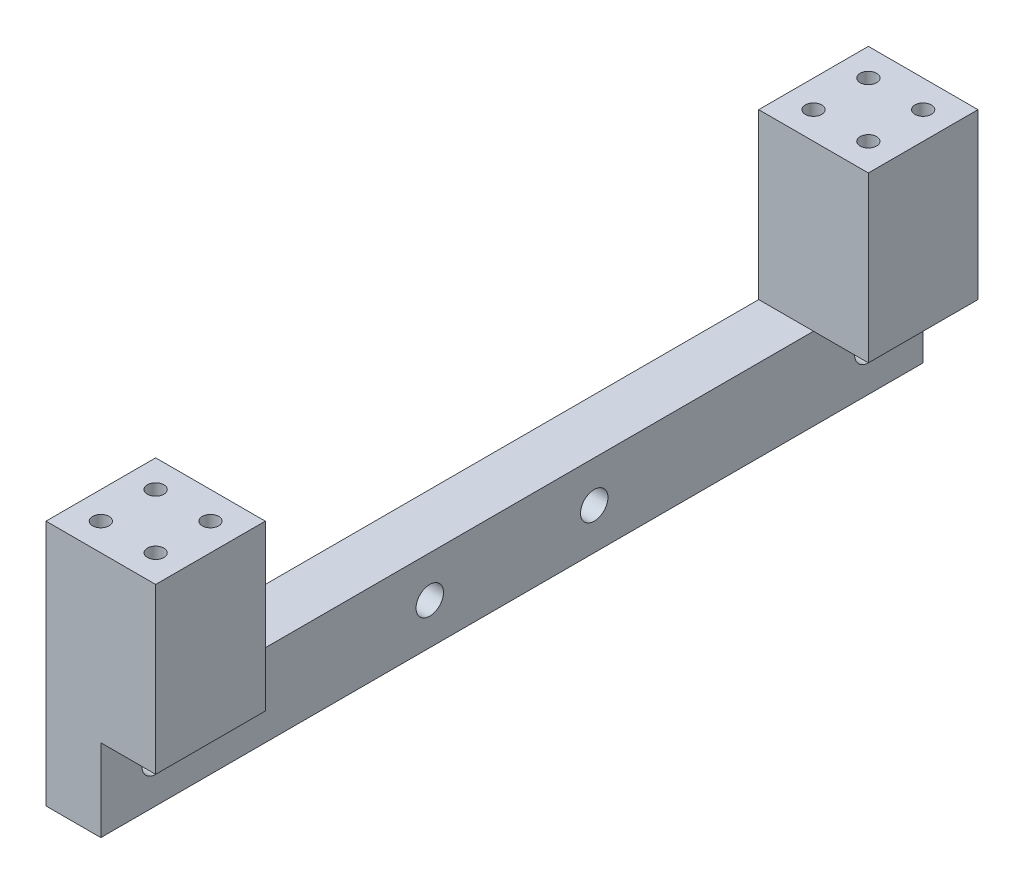
ISO-10303-21;
HEADER;
FILE_DESCRIPTION(('STEP AP214'),'2;1');
FILE_NAME('part.step','',(''),(''),'','','');
FILE_SCHEMA(('AUTOMOTIVE_DESIGN { 1 0 10303 214 1 1 1 1 }'));
ENDSEC;
DATA;
#1=APPLICATION_CONTEXT('core data for automotive mechanical design processes');
#2=APPLICATION_PROTOCOL_DEFINITION('international standard','automotive_design',2000,#1);
#3=PRODUCT_CONTEXT('',#1,'mechanical');
#4=PRODUCT('Part','Part','',(#3));
#5=PRODUCT_RELATED_PRODUCT_CATEGORY('part','',(#4));
#6=PRODUCT_DEFINITION_FORMATION('','',#4);
#7=PRODUCT_DEFINITION_CONTEXT('part definition',#1,'design');
#8=PRODUCT_DEFINITION('design','',#6,#7);
#9=PRODUCT_DEFINITION_SHAPE('','',#8);
#10=(LENGTH_UNIT() NAMED_UNIT(*) SI_UNIT(.MILLI.,.METRE.));
#11=(NAMED_UNIT(*) PLANE_ANGLE_UNIT() SI_UNIT($,.RADIAN.));
#12=(NAMED_UNIT(*) SI_UNIT($,.STERADIAN.) SOLID_ANGLE_UNIT());
#13=UNCERTAINTY_MEASURE_WITH_UNIT(LENGTH_MEASURE(1.E-05),#10,'distance_accuracy_value','');
#14=(GEOMETRIC_REPRESENTATION_CONTEXT(3) GLOBAL_UNCERTAINTY_ASSIGNED_CONTEXT((#13)) GLOBAL_UNIT_ASSIGNED_CONTEXT((#10,
#11,#12)) REPRESENTATION_CONTEXT('',''));
#15=CARTESIAN_POINT('',(0.,0.,0.));
#16=DIRECTION('',(0.,0.,1.));
#17=DIRECTION('',(1.,0.,0.));
#18=AXIS2_PLACEMENT_3D('',#15,#16,#17);
#19=CARTESIAN_POINT('',(0.,15.,0.));
#20=DIRECTION('',(0.,-1.,0.));
#21=DIRECTION('',(0.,0.,-1.));
#22=AXIS2_PLACEMENT_3D('',#19,#20,#21);
#23=PLANE('',#22);
#24=DIRECTION('',(-1.,0.,0.));
#25=VECTOR('',#24,1.);
#26=CARTESIAN_POINT('',(15.,15.,55.));
#27=LINE('',#26,#25);
#28=CARTESIAN_POINT('',(5.,15.,55.));
#29=VERTEX_POINT('',#28);
#30=CARTESIAN_POINT('',(-5.,15.,55.));
#31=VERTEX_POINT('',#30);
#32=EDGE_CURVE('E55',#29,#31,#27,.T.);
#33=ORIENTED_EDGE('',*,*,#32,.F.);
#34=DIRECTION('',(0.,0.,-1.));
#35=VECTOR('',#34,1.);
#36=CARTESIAN_POINT('',(5.,15.,75.));
#37=LINE('',#36,#35);
#38=CARTESIAN_POINT('',(5.,15.,-55.));
#39=VERTEX_POINT('',#38);
#40=EDGE_CURVE('E221',#29,#39,#37,.T.);
#41=ORIENTED_EDGE('',*,*,#40,.T.);
#42=DIRECTION('',(1.,0.,0.));
#43=VECTOR('',#42,1.);
#44=CARTESIAN_POINT('',(15.,15.,-55.));
#45=LINE('',#44,#43);
#46=CARTESIAN_POINT('',(-5.,15.,-55.));
#47=VERTEX_POINT('',#46);
#48=EDGE_CURVE('E195',#47,#39,#45,.T.);
#49=ORIENTED_EDGE('',*,*,#48,.F.);
#50=DIRECTION('',(0.,0.,1.));
#51=VECTOR('',#50,1.);
#52=CARTESIAN_POINT('',(-5.,15.,75.));
#53=LINE('',#52,#51);
#54=EDGE_CURVE('E60',#47,#31,#53,.T.);
#55=ORIENTED_EDGE('',*,*,#54,.T.);
#56=EDGE_LOOP('',(#33,#41,#49,#55));
#57=FACE_BOUND('',#56,.T.);
#58=ADVANCED_FACE('F39',(#57),#23,.F.);
#59=CARTESIAN_POINT('',(5.,15.,75.));
#60=DIRECTION('',(-1.,0.,0.));
#61=DIRECTION('',(0.,0.,1.));
#62=AXIS2_PLACEMENT_3D('',#59,#60,#61);
#63=PLANE('',#62);
#64=CARTESIAN_POINT('',(5.,7.5,-65.));
#65=DIRECTION('',(-1.,0.,0.));
#66=DIRECTION('',(0.,0.,1.));
#67=AXIS2_PLACEMENT_3D('',#64,#65,#66);
#68=CIRCLE('',#67,2.50000000000001);
#69=CARTESIAN_POINT('',(5.,7.5,-62.5));
#70=VERTEX_POINT('',#69);
#71=EDGE_CURVE('E156',#70,#70,#68,.T.);
#72=ORIENTED_EDGE('',*,*,#71,.T.);
#73=EDGE_LOOP('',(#72));
#74=FACE_BOUND('',#73,.T.);
#75=CARTESIAN_POINT('',(5.,7.5,-15.));
#76=DIRECTION('',(-1.,0.,0.));
#77=DIRECTION('',(0.,0.,1.));
#78=AXIS2_PLACEMENT_3D('',#75,#76,#77);
#79=CIRCLE('',#78,2.5);
#80=CARTESIAN_POINT('',(5.,7.5,-12.5));
#81=VERTEX_POINT('',#80);
#82=EDGE_CURVE('E660',#81,#81,#79,.T.);
#83=ORIENTED_EDGE('',*,*,#82,.T.);
#84=EDGE_LOOP('',(#83));
#85=FACE_BOUND('',#84,.T.);
#86=CARTESIAN_POINT('',(5.,7.5,15.));
#87=DIRECTION('',(-1.,0.,0.));
#88=DIRECTION('',(0.,0.,1.));
#89=AXIS2_PLACEMENT_3D('',#86,#87,#88);
#90=CIRCLE('',#89,2.5);
#91=CARTESIAN_POINT('',(5.,7.5,17.5));
#92=VERTEX_POINT('',#91);
#93=EDGE_CURVE('E657',#92,#92,#90,.T.);
#94=ORIENTED_EDGE('',*,*,#93,.T.);
#95=EDGE_LOOP('',(#94));
#96=FACE_BOUND('',#95,.T.);
#97=CARTESIAN_POINT('',(5.,7.5,65.));
#98=DIRECTION('',(-1.,0.,0.));
#99=DIRECTION('',(0.,0.,1.));
#100=AXIS2_PLACEMENT_3D('',#97,#98,#99);
#101=CIRCLE('',#100,2.50000000000001);
#102=CARTESIAN_POINT('',(5.,7.5,67.5));
#103=VERTEX_POINT('',#102);
#104=EDGE_CURVE('E642',#103,#103,#101,.T.);
#105=ORIENTED_EDGE('',*,*,#104,.T.);
#106=EDGE_LOOP('',(#105));
#107=FACE_BOUND('',#106,.T.);
#108=DIRECTION('',(0.,0.,-1.));
#109=VECTOR('',#108,1.);
#110=CARTESIAN_POINT('',(5.,0.,75.));
#111=LINE('',#110,#109);
#112=CARTESIAN_POINT('',(5.,0.,75.));
#113=VERTEX_POINT('',#112);
#114=CARTESIAN_POINT('',(5.,0.,-75.));
#115=VERTEX_POINT('',#114);
#116=EDGE_CURVE('E216',#113,#115,#111,.T.);
#117=ORIENTED_EDGE('',*,*,#116,.T.);
#118=DIRECTION('',(0.,-1.,0.));
#119=VECTOR('',#118,1.);
#120=CARTESIAN_POINT('',(5.,15.,-75.));
#121=LINE('',#120,#119);
#122=CARTESIAN_POINT('',(5.,15.,-75.));
#123=VERTEX_POINT('',#122);
#124=EDGE_CURVE('E11',#123,#115,#121,.T.);
#125=ORIENTED_EDGE('',*,*,#124,.F.);
#126=EDGE_CURVE('E222',#39,#123,#37,.T.);
#127=ORIENTED_EDGE('',*,*,#126,.F.);
#128=ORIENTED_EDGE('',*,*,#40,.F.);
#129=CARTESIAN_POINT('',(5.,15.,75.));
#130=VERTEX_POINT('',#129);
#131=EDGE_CURVE('E217',#130,#29,#37,.T.);
#132=ORIENTED_EDGE('',*,*,#131,.F.);
#133=DIRECTION('',(0.,-1.,0.));
#134=VECTOR('',#133,1.);
#135=CARTESIAN_POINT('',(5.,15.,75.));
#136=LINE('',#135,#134);
#137=EDGE_CURVE('E133',#130,#113,#136,.T.);
#138=ORIENTED_EDGE('',*,*,#137,.T.);
#139=EDGE_LOOP('',(#117,#125,#127,#128,#132,#138));
#140=FACE_BOUND('',#139,.T.);
#141=ADVANCED_FACE('F41',(#74,#85,#96,#107,#140),#63,.F.);
#142=CARTESIAN_POINT('',(-5.,15.,-75.));
#143=DIRECTION('',(0.,0.,1.));
#144=DIRECTION('',(1.,0.,0.));
#145=AXIS2_PLACEMENT_3D('',#142,#143,#144);
#146=PLANE('',#145);
#147=DIRECTION('',(-1.,0.,0.));
#148=VECTOR('',#147,1.);
#149=CARTESIAN_POINT('',(-5.,0.,-75.));
#150=LINE('',#149,#148);
#151=CARTESIAN_POINT('',(-5.,0.,-75.));
#152=VERTEX_POINT('',#151);
#153=EDGE_CURVE('E228',#115,#152,#150,.T.);
#154=ORIENTED_EDGE('',*,*,#153,.T.);
#155=DIRECTION('',(0.,-1.,0.));
#156=VECTOR('',#155,1.);
#157=CARTESIAN_POINT('',(-5.,15.,-75.));
#158=LINE('',#157,#156);
#159=CARTESIAN_POINT('',(-5.,45.,-75.));
#160=VERTEX_POINT('',#159);
#161=EDGE_CURVE('E48',#160,#152,#158,.T.);
#162=ORIENTED_EDGE('',*,*,#161,.F.);
#163=DIRECTION('',(-1.,0.,0.));
#164=VECTOR('',#163,1.);
#165=CARTESIAN_POINT('',(15.,45.,-75.));
#166=LINE('',#165,#164);
#167=CARTESIAN_POINT('',(15.,45.,-75.));
#168=VERTEX_POINT('',#167);
#169=EDGE_CURVE('E190',#168,#160,#166,.T.);
#170=ORIENTED_EDGE('',*,*,#169,.F.);
#171=DIRECTION('',(0.,-1.,0.));
#172=VECTOR('',#171,1.);
#173=CARTESIAN_POINT('',(15.,45.,-75.));
#174=LINE('',#173,#172);
#175=CARTESIAN_POINT('',(15.,15.,-75.));
#176=VERTEX_POINT('',#175);
#177=EDGE_CURVE('E194',#168,#176,#174,.T.);
#178=ORIENTED_EDGE('',*,*,#177,.T.);
#179=DIRECTION('',(-1.,0.,0.));
#180=VECTOR('',#179,1.);
#181=CARTESIAN_POINT('',(15.,15.,-75.));
#182=LINE('',#181,#180);
#183=EDGE_CURVE('E184',#176,#123,#182,.T.);
#184=ORIENTED_EDGE('',*,*,#183,.T.);
#185=ORIENTED_EDGE('',*,*,#124,.T.);
#186=EDGE_LOOP('',(#154,#162,#170,#178,#184,#185));
#187=FACE_BOUND('',#186,.T.);
#188=ADVANCED_FACE('F274',(#187),#146,.F.);
#189=CARTESIAN_POINT('',(-5.,15.,75.));
#190=DIRECTION('',(1.,0.,0.));
#191=DIRECTION('',(0.,0.,-1.));
#192=AXIS2_PLACEMENT_3D('',#189,#190,#191);
#193=PLANE('',#192);
#194=CARTESIAN_POINT('',(-5.,7.5,-65.));
#195=DIRECTION('',(-1.,0.,0.));
#196=DIRECTION('',(0.,0.,1.));
#197=AXIS2_PLACEMENT_3D('',#194,#195,#196);
#198=CIRCLE('',#197,2.50000000000001);
#199=CARTESIAN_POINT('',(-5.,7.5,-62.5));
#200=VERTEX_POINT('',#199);
#201=EDGE_CURVE('E638',#200,#200,#198,.T.);
#202=ORIENTED_EDGE('',*,*,#201,.F.);
#203=EDGE_LOOP('',(#202));
#204=FACE_BOUND('',#203,.T.);
#205=CARTESIAN_POINT('',(-5.,7.5,-15.));
#206=DIRECTION('',(-1.,0.,0.));
#207=DIRECTION('',(0.,0.,1.));
#208=AXIS2_PLACEMENT_3D('',#205,#206,#207);
#209=CIRCLE('',#208,2.5);
#210=CARTESIAN_POINT('',(-5.,7.5,-12.5));
#211=VERTEX_POINT('',#210);
#212=EDGE_CURVE('E643',#211,#211,#209,.T.);
#213=ORIENTED_EDGE('',*,*,#212,.F.);
#214=EDGE_LOOP('',(#213));
#215=FACE_BOUND('',#214,.T.);
#216=CARTESIAN_POINT('',(-5.,7.5,15.));
#217=DIRECTION('',(-1.,0.,0.));
#218=DIRECTION('',(0.,0.,1.));
#219=AXIS2_PLACEMENT_3D('',#216,#217,#218);
#220=CIRCLE('',#219,2.5);
#221=CARTESIAN_POINT('',(-5.,7.5,17.5));
#222=VERTEX_POINT('',#221);
#223=EDGE_CURVE('E647',#222,#222,#220,.T.);
#224=ORIENTED_EDGE('',*,*,#223,.F.);
#225=EDGE_LOOP('',(#224));
#226=FACE_BOUND('',#225,.T.);
#227=CARTESIAN_POINT('',(-5.,7.5,65.));
#228=DIRECTION('',(-1.,0.,0.));
#229=DIRECTION('',(0.,0.,1.));
#230=AXIS2_PLACEMENT_3D('',#227,#228,#229);
#231=CIRCLE('',#230,2.50000000000001);
#232=CARTESIAN_POINT('',(-5.,7.5,67.5));
#233=VERTEX_POINT('',#232);
#234=EDGE_CURVE('E634',#233,#233,#231,.T.);
#235=ORIENTED_EDGE('',*,*,#234,.F.);
#236=EDGE_LOOP('',(#235));
#237=FACE_BOUND('',#236,.T.);
#238=DIRECTION('',(0.,0.,1.));
#239=VECTOR('',#238,1.);
#240=CARTESIAN_POINT('',(-5.,0.,75.));
#241=LINE('',#240,#239);
#242=CARTESIAN_POINT('',(-5.,0.,75.));
#243=VERTEX_POINT('',#242);
#244=EDGE_CURVE('E129',#152,#243,#241,.T.);
#245=ORIENTED_EDGE('',*,*,#244,.T.);
#246=DIRECTION('',(0.,-1.,0.));
#247=VECTOR('',#246,1.);
#248=CARTESIAN_POINT('',(-5.,15.,75.));
#249=LINE('',#248,#247);
#250=CARTESIAN_POINT('',(-5.,45.,75.));
#251=VERTEX_POINT('',#250);
#252=EDGE_CURVE('E121',#251,#243,#249,.T.);
#253=ORIENTED_EDGE('',*,*,#252,.F.);
#254=DIRECTION('',(0.,0.,1.));
#255=VECTOR('',#254,1.);
#256=CARTESIAN_POINT('',(-5.,45.,55.));
#257=LINE('',#256,#255);
#258=CARTESIAN_POINT('',(-5.,45.,55.));
#259=VERTEX_POINT('',#258);
#260=EDGE_CURVE('E126',#259,#251,#257,.T.);
#261=ORIENTED_EDGE('',*,*,#260,.F.);
#262=DIRECTION('',(0.,-1.,0.));
#263=VECTOR('',#262,1.);
#264=CARTESIAN_POINT('',(-5.,45.,55.));
#265=LINE('',#264,#263);
#266=EDGE_CURVE('E163',#259,#31,#265,.T.);
#267=ORIENTED_EDGE('',*,*,#266,.T.);
#268=ORIENTED_EDGE('',*,*,#54,.F.);
#269=DIRECTION('',(0.,-1.,0.));
#270=VECTOR('',#269,1.);
#271=CARTESIAN_POINT('',(-5.,45.,-55.));
#272=LINE('',#271,#270);
#273=CARTESIAN_POINT('',(-5.,45.,-55.));
#274=VERTEX_POINT('',#273);
#275=EDGE_CURVE('E212',#274,#47,#272,.T.);
#276=ORIENTED_EDGE('',*,*,#275,.F.);
#277=DIRECTION('',(0.,0.,1.));
#278=VECTOR('',#277,1.);
#279=CARTESIAN_POINT('',(-5.,45.,-55.));
#280=LINE('',#279,#278);
#281=EDGE_CURVE('E179',#160,#274,#280,.T.);
#282=ORIENTED_EDGE('',*,*,#281,.F.);
#283=ORIENTED_EDGE('',*,*,#161,.T.);
#284=EDGE_LOOP('',(#245,#253,#261,#267,#268,#276,#282,#283));
#285=FACE_BOUND('',#284,.T.);
#286=ADVANCED_FACE('F123',(#204,#215,#226,#237,#285),#193,.F.);
#287=CARTESIAN_POINT('',(-5.,15.,75.));
#288=DIRECTION('',(0.,0.,-1.));
#289=DIRECTION('',(-1.,0.,0.));
#290=AXIS2_PLACEMENT_3D('',#287,#288,#289);
#291=PLANE('',#290);
#292=DIRECTION('',(1.,0.,0.));
#293=VECTOR('',#292,1.);
#294=CARTESIAN_POINT('',(-5.,0.,75.));
#295=LINE('',#294,#293);
#296=EDGE_CURVE('E233',#243,#113,#295,.T.);
#297=ORIENTED_EDGE('',*,*,#296,.T.);
#298=ORIENTED_EDGE('',*,*,#137,.F.);
#299=DIRECTION('',(1.,0.,0.));
#300=VECTOR('',#299,1.);
#301=CARTESIAN_POINT('',(15.,15.,75.));
#302=LINE('',#301,#300);
#303=CARTESIAN_POINT('',(15.,15.,75.));
#304=VERTEX_POINT('',#303);
#305=EDGE_CURVE('E164',#130,#304,#302,.T.);
#306=ORIENTED_EDGE('',*,*,#305,.T.);
#307=DIRECTION('',(0.,-1.,0.));
#308=VECTOR('',#307,1.);
#309=CARTESIAN_POINT('',(15.,45.,75.));
#310=LINE('',#309,#308);
#311=CARTESIAN_POINT('',(15.,45.,75.));
#312=VERTEX_POINT('',#311);
#313=EDGE_CURVE('E139',#312,#304,#310,.T.);
#314=ORIENTED_EDGE('',*,*,#313,.F.);
#315=DIRECTION('',(1.,0.,0.));
#316=VECTOR('',#315,1.);
#317=CARTESIAN_POINT('',(15.,45.,75.));
#318=LINE('',#317,#316);
#319=EDGE_CURVE('E136',#251,#312,#318,.T.);
#320=ORIENTED_EDGE('',*,*,#319,.F.);
#321=ORIENTED_EDGE('',*,*,#252,.T.);
#322=EDGE_LOOP('',(#297,#298,#306,#314,#320,#321));
#323=FACE_BOUND('',#322,.T.);
#324=ADVANCED_FACE('F137',(#323),#291,.F.);
#325=CARTESIAN_POINT('',(0.,0.,0.));
#326=DIRECTION('',(0.,-1.,0.));
#327=DIRECTION('',(0.,0.,-1.));
#328=AXIS2_PLACEMENT_3D('',#325,#326,#327);
#329=PLANE('',#328);
#330=ORIENTED_EDGE('',*,*,#116,.F.);
#331=ORIENTED_EDGE('',*,*,#296,.F.);
#332=ORIENTED_EDGE('',*,*,#244,.F.);
#333=ORIENTED_EDGE('',*,*,#153,.F.);
#334=EDGE_LOOP('',(#330,#331,#332,#333));
#335=FACE_BOUND('',#334,.T.);
#336=ADVANCED_FACE('F245',(#335),#329,.T.);
#337=CARTESIAN_POINT('',(0.,15.,0.));
#338=DIRECTION('',(0.,1.,0.));
#339=DIRECTION('',(0.,0.,1.));
#340=AXIS2_PLACEMENT_3D('',#337,#338,#339);
#341=PLANE('',#340);
#342=CARTESIAN_POINT('',(15.,15.,-55.));
#343=VERTEX_POINT('',#342);
#344=EDGE_CURVE('E178',#39,#343,#45,.T.);
#345=ORIENTED_EDGE('',*,*,#344,.F.);
#346=ORIENTED_EDGE('',*,*,#126,.T.);
#347=ORIENTED_EDGE('',*,*,#183,.F.);
#348=DIRECTION('',(0.,0.,-1.));
#349=VECTOR('',#348,1.);
#350=CARTESIAN_POINT('',(15.,15.,-55.));
#351=LINE('',#350,#349);
#352=EDGE_CURVE('E199',#343,#176,#351,.T.);
#353=ORIENTED_EDGE('',*,*,#352,.F.);
#354=EDGE_LOOP('',(#345,#346,#347,#353));
#355=FACE_BOUND('',#354,.T.);
#356=ADVANCED_FACE('F282',(#355),#341,.F.);
#357=CARTESIAN_POINT('',(15.,45.,-55.));
#358=DIRECTION('',(0.,0.,-1.));
#359=DIRECTION('',(-1.,0.,0.));
#360=AXIS2_PLACEMENT_3D('',#357,#358,#359);
#361=PLANE('',#360);
#362=ORIENTED_EDGE('',*,*,#48,.T.);
#363=ORIENTED_EDGE('',*,*,#344,.T.);
#364=DIRECTION('',(0.,-1.,0.));
#365=VECTOR('',#364,1.);
#366=CARTESIAN_POINT('',(15.,45.,-55.));
#367=LINE('',#366,#365);
#368=CARTESIAN_POINT('',(15.,45.,-55.));
#369=VERTEX_POINT('',#368);
#370=EDGE_CURVE('E208',#369,#343,#367,.T.);
#371=ORIENTED_EDGE('',*,*,#370,.F.);
#372=DIRECTION('',(1.,0.,0.));
#373=VECTOR('',#372,1.);
#374=CARTESIAN_POINT('',(15.,45.,-55.));
#375=LINE('',#374,#373);
#376=EDGE_CURVE('E183',#274,#369,#375,.T.);
#377=ORIENTED_EDGE('',*,*,#376,.F.);
#378=ORIENTED_EDGE('',*,*,#275,.T.);
#379=EDGE_LOOP('',(#362,#363,#371,#377,#378));
#380=FACE_BOUND('',#379,.T.);
#381=ADVANCED_FACE('F278',(#380),#361,.F.);
#382=CARTESIAN_POINT('',(15.,45.,-55.));
#383=DIRECTION('',(-1.,0.,0.));
#384=DIRECTION('',(0.,0.,1.));
#385=AXIS2_PLACEMENT_3D('',#382,#383,#384);
#386=PLANE('',#385);
#387=ORIENTED_EDGE('',*,*,#352,.T.);
#388=ORIENTED_EDGE('',*,*,#177,.F.);
#389=DIRECTION('',(0.,0.,-1.));
#390=VECTOR('',#389,1.);
#391=CARTESIAN_POINT('',(15.,45.,-55.));
#392=LINE('',#391,#390);
#393=EDGE_CURVE('E187',#369,#168,#392,.T.);
#394=ORIENTED_EDGE('',*,*,#393,.F.);
#395=ORIENTED_EDGE('',*,*,#370,.T.);
#396=EDGE_LOOP('',(#387,#388,#394,#395));
#397=FACE_BOUND('',#396,.T.);
#398=ADVANCED_FACE('F303',(#397),#386,.F.);
#399=CARTESIAN_POINT('',(0.,45.,0.));
#400=DIRECTION('',(0.,1.,0.));
#401=DIRECTION('',(0.,0.,1.));
#402=AXIS2_PLACEMENT_3D('',#399,#400,#401);
#403=PLANE('',#402);
#404=CARTESIAN_POINT('',(10.,45.,-70.));
#405=DIRECTION('',(0.,1.,0.));
#406=DIRECTION('',(0.,0.,1.));
#407=AXIS2_PLACEMENT_3D('',#404,#405,#406);
#408=CIRCLE('',#407,1.5);
#409=CARTESIAN_POINT('',(10.,45.,-68.5));
#410=VERTEX_POINT('',#409);
#411=EDGE_CURVE('E619',#410,#410,#408,.T.);
#412=ORIENTED_EDGE('',*,*,#411,.F.);
#413=EDGE_LOOP('',(#412));
#414=FACE_BOUND('',#413,.T.);
#415=CARTESIAN_POINT('',(0.,45.,-60.));
#416=DIRECTION('',(0.,1.,0.));
#417=DIRECTION('',(0.,0.,1.));
#418=AXIS2_PLACEMENT_3D('',#415,#416,#417);
#419=CIRCLE('',#418,1.5);
#420=CARTESIAN_POINT('',(0.,45.,-58.5));
#421=VERTEX_POINT('',#420);
#422=EDGE_CURVE('E610',#421,#421,#419,.T.);
#423=ORIENTED_EDGE('',*,*,#422,.F.);
#424=EDGE_LOOP('',(#423));
#425=FACE_BOUND('',#424,.T.);
#426=CARTESIAN_POINT('',(10.,45.,-60.));
#427=DIRECTION('',(0.,1.,0.));
#428=DIRECTION('',(0.,0.,1.));
#429=AXIS2_PLACEMENT_3D('',#426,#427,#428);
#430=CIRCLE('',#429,1.5);
#431=CARTESIAN_POINT('',(10.,45.,-58.5));
#432=VERTEX_POINT('',#431);
#433=EDGE_CURVE('E604',#432,#432,#430,.T.);
#434=ORIENTED_EDGE('',*,*,#433,.F.);
#435=EDGE_LOOP('',(#434));
#436=FACE_BOUND('',#435,.T.);
#437=CARTESIAN_POINT('',(0.,45.,-70.));
#438=DIRECTION('',(0.,1.,0.));
#439=DIRECTION('',(0.,0.,1.));
#440=AXIS2_PLACEMENT_3D('',#437,#438,#439);
#441=CIRCLE('',#440,1.5);
#442=CARTESIAN_POINT('',(0.,45.,-68.5));
#443=VERTEX_POINT('',#442);
#444=EDGE_CURVE('E618',#443,#443,#441,.T.);
#445=ORIENTED_EDGE('',*,*,#444,.F.);
#446=EDGE_LOOP('',(#445));
#447=FACE_BOUND('',#446,.T.);
#448=ORIENTED_EDGE('',*,*,#281,.T.);
#449=ORIENTED_EDGE('',*,*,#376,.T.);
#450=ORIENTED_EDGE('',*,*,#393,.T.);
#451=ORIENTED_EDGE('',*,*,#169,.T.);
#452=EDGE_LOOP('',(#448,#449,#450,#451));
#453=FACE_BOUND('',#452,.T.);
#454=ADVANCED_FACE('F266',(#414,#425,#436,#447,#453),#403,.T.);
#455=CARTESIAN_POINT('',(0.,15.,0.));
#456=DIRECTION('',(0.,-1.,0.));
#457=DIRECTION('',(0.,0.,-1.));
#458=AXIS2_PLACEMENT_3D('',#455,#456,#457);
#459=PLANE('',#458);
#460=ORIENTED_EDGE('',*,*,#131,.T.);
#461=CARTESIAN_POINT('',(15.,15.,55.));
#462=VERTEX_POINT('',#461);
#463=EDGE_CURVE('E150',#462,#29,#27,.T.);
#464=ORIENTED_EDGE('',*,*,#463,.F.);
#465=DIRECTION('',(0.,0.,-1.));
#466=VECTOR('',#465,1.);
#467=CARTESIAN_POINT('',(15.,15.,55.));
#468=LINE('',#467,#466);
#469=EDGE_CURVE('E167',#304,#462,#468,.T.);
#470=ORIENTED_EDGE('',*,*,#469,.F.);
#471=ORIENTED_EDGE('',*,*,#305,.F.);
#472=EDGE_LOOP('',(#460,#464,#470,#471));
#473=FACE_BOUND('',#472,.T.);
#474=ADVANCED_FACE('F252',(#473),#459,.T.);
#475=CARTESIAN_POINT('',(15.,45.,55.));
#476=DIRECTION('',(-1.,0.,0.));
#477=DIRECTION('',(0.,0.,1.));
#478=AXIS2_PLACEMENT_3D('',#475,#476,#477);
#479=PLANE('',#478);
#480=ORIENTED_EDGE('',*,*,#469,.T.);
#481=DIRECTION('',(0.,-1.,0.));
#482=VECTOR('',#481,1.);
#483=CARTESIAN_POINT('',(15.,45.,55.));
#484=LINE('',#483,#482);
#485=CARTESIAN_POINT('',(15.,45.,55.));
#486=VERTEX_POINT('',#485);
#487=EDGE_CURVE('E172',#486,#462,#484,.T.);
#488=ORIENTED_EDGE('',*,*,#487,.F.);
#489=DIRECTION('',(0.,0.,-1.));
#490=VECTOR('',#489,1.);
#491=CARTESIAN_POINT('',(15.,45.,55.));
#492=LINE('',#491,#490);
#493=EDGE_CURVE('E143',#312,#486,#492,.T.);
#494=ORIENTED_EDGE('',*,*,#493,.F.);
#495=ORIENTED_EDGE('',*,*,#313,.T.);
#496=EDGE_LOOP('',(#480,#488,#494,#495));
#497=FACE_BOUND('',#496,.T.);
#498=ADVANCED_FACE('F258',(#497),#479,.F.);
#499=CARTESIAN_POINT('',(15.,45.,55.));
#500=DIRECTION('',(0.,0.,1.));
#501=DIRECTION('',(1.,0.,0.));
#502=AXIS2_PLACEMENT_3D('',#499,#500,#501);
#503=PLANE('',#502);
#504=ORIENTED_EDGE('',*,*,#463,.T.);
#505=ORIENTED_EDGE('',*,*,#32,.T.);
#506=ORIENTED_EDGE('',*,*,#266,.F.);
#507=DIRECTION('',(-1.,0.,0.));
#508=VECTOR('',#507,1.);
#509=CARTESIAN_POINT('',(15.,45.,55.));
#510=LINE('',#509,#508);
#511=EDGE_CURVE('E147',#486,#259,#510,.T.);
#512=ORIENTED_EDGE('',*,*,#511,.F.);
#513=ORIENTED_EDGE('',*,*,#487,.T.);
#514=EDGE_LOOP('',(#504,#505,#506,#512,#513));
#515=FACE_BOUND('',#514,.T.);
#516=ADVANCED_FACE('F255',(#515),#503,.F.);
#517=CARTESIAN_POINT('',(0.,45.,0.));
#518=DIRECTION('',(0.,-1.,0.));
#519=DIRECTION('',(0.,0.,-1.));
#520=AXIS2_PLACEMENT_3D('',#517,#518,#519);
#521=PLANE('',#520);
#522=CARTESIAN_POINT('',(10.,45.,70.));
#523=DIRECTION('',(0.,-1.,0.));
#524=DIRECTION('',(0.,0.,-1.));
#525=AXIS2_PLACEMENT_3D('',#522,#523,#524);
#526=CIRCLE('',#525,1.5);
#527=CARTESIAN_POINT('',(10.,45.,68.5));
#528=VERTEX_POINT('',#527);
#529=EDGE_CURVE('E580',#528,#528,#526,.T.);
#530=ORIENTED_EDGE('',*,*,#529,.T.);
#531=EDGE_LOOP('',(#530));
#532=FACE_BOUND('',#531,.T.);
#533=CARTESIAN_POINT('',(0.,45.,60.));
#534=DIRECTION('',(0.,-1.,0.));
#535=DIRECTION('',(0.,0.,-1.));
#536=AXIS2_PLACEMENT_3D('',#533,#534,#535);
#537=CIRCLE('',#536,1.5);
#538=CARTESIAN_POINT('',(0.,45.,58.5));
#539=VERTEX_POINT('',#538);
#540=EDGE_CURVE('E597',#539,#539,#537,.T.);
#541=ORIENTED_EDGE('',*,*,#540,.T.);
#542=EDGE_LOOP('',(#541));
#543=FACE_BOUND('',#542,.T.);
#544=CARTESIAN_POINT('',(10.,45.,60.));
#545=DIRECTION('',(0.,-1.,0.));
#546=DIRECTION('',(0.,0.,-1.));
#547=AXIS2_PLACEMENT_3D('',#544,#545,#546);
#548=CIRCLE('',#547,1.5);
#549=CARTESIAN_POINT('',(10.,45.,58.5));
#550=VERTEX_POINT('',#549);
#551=EDGE_CURVE('E591',#550,#550,#548,.T.);
#552=ORIENTED_EDGE('',*,*,#551,.T.);
#553=EDGE_LOOP('',(#552));
#554=FACE_BOUND('',#553,.T.);
#555=CARTESIAN_POINT('',(0.,45.,70.));
#556=DIRECTION('',(0.,-1.,0.));
#557=DIRECTION('',(0.,0.,-1.));
#558=AXIS2_PLACEMENT_3D('',#555,#556,#557);
#559=CIRCLE('',#558,1.5);
#560=CARTESIAN_POINT('',(0.,45.,68.5));
#561=VERTEX_POINT('',#560);
#562=EDGE_CURVE('E579',#561,#561,#559,.T.);
#563=ORIENTED_EDGE('',*,*,#562,.T.);
#564=EDGE_LOOP('',(#563));
#565=FACE_BOUND('',#564,.T.);
#566=ORIENTED_EDGE('',*,*,#260,.T.);
#567=ORIENTED_EDGE('',*,*,#319,.T.);
#568=ORIENTED_EDGE('',*,*,#493,.T.);
#569=ORIENTED_EDGE('',*,*,#511,.T.);
#570=EDGE_LOOP('',(#566,#567,#568,#569));
#571=FACE_BOUND('',#570,.T.);
#572=ADVANCED_FACE('F145',(#532,#543,#554,#565,#571),#521,.F.);
#573=CARTESIAN_POINT('',(15.,7.5,65.));
#574=DIRECTION('',(-1.,0.,0.));
#575=DIRECTION('',(0.,0.,1.));
#576=AXIS2_PLACEMENT_3D('',#573,#574,#575);
#577=CYLINDRICAL_SURFACE('',#576,2.50000000000001);
#578=ORIENTED_EDGE('',*,*,#234,.T.);
#579=EDGE_LOOP('',(#578));
#580=FACE_BOUND('',#579,.T.);
#581=ORIENTED_EDGE('',*,*,#104,.F.);
#582=EDGE_LOOP('',(#581));
#583=FACE_BOUND('',#582,.T.);
#584=ADVANCED_FACE('F364',(#580,#583),#577,.F.);
#585=CARTESIAN_POINT('',(15.,7.5,15.));
#586=DIRECTION('',(-1.,0.,0.));
#587=DIRECTION('',(0.,0.,1.));
#588=AXIS2_PLACEMENT_3D('',#585,#586,#587);
#589=CYLINDRICAL_SURFACE('',#588,2.5);
#590=ORIENTED_EDGE('',*,*,#223,.T.);
#591=EDGE_LOOP('',(#590));
#592=FACE_BOUND('',#591,.T.);
#593=ORIENTED_EDGE('',*,*,#93,.F.);
#594=EDGE_LOOP('',(#593));
#595=FACE_BOUND('',#594,.T.);
#596=ADVANCED_FACE('F369',(#592,#595),#589,.F.);
#597=CARTESIAN_POINT('',(15.,7.5,-15.));
#598=DIRECTION('',(-1.,0.,0.));
#599=DIRECTION('',(0.,0.,1.));
#600=AXIS2_PLACEMENT_3D('',#597,#598,#599);
#601=CYLINDRICAL_SURFACE('',#600,2.5);
#602=ORIENTED_EDGE('',*,*,#212,.T.);
#603=EDGE_LOOP('',(#602));
#604=FACE_BOUND('',#603,.T.);
#605=ORIENTED_EDGE('',*,*,#82,.F.);
#606=EDGE_LOOP('',(#605));
#607=FACE_BOUND('',#606,.T.);
#608=ADVANCED_FACE('F379',(#604,#607),#601,.F.);
#609=CARTESIAN_POINT('',(15.,7.5,-65.));
#610=DIRECTION('',(-1.,0.,0.));
#611=DIRECTION('',(0.,0.,1.));
#612=AXIS2_PLACEMENT_3D('',#609,#610,#611);
#613=CYLINDRICAL_SURFACE('',#612,2.50000000000001);
#614=ORIENTED_EDGE('',*,*,#201,.T.);
#615=EDGE_LOOP('',(#614));
#616=FACE_BOUND('',#615,.T.);
#617=ORIENTED_EDGE('',*,*,#71,.F.);
#618=EDGE_LOOP('',(#617));
#619=FACE_BOUND('',#618,.T.);
#620=ADVANCED_FACE('F389',(#616,#619),#613,.F.);
#621=CARTESIAN_POINT('',(0.,35.,-70.));
#622=DIRECTION('',(0.,1.,0.));
#623=DIRECTION('',(0.,0.,1.));
#624=AXIS2_PLACEMENT_3D('',#621,#622,#623);
#625=CYLINDRICAL_SURFACE('',#624,1.5);
#626=CARTESIAN_POINT('',(0.,35.,-70.));
#627=DIRECTION('',(0.,1.,0.));
#628=DIRECTION('',(0.,0.,1.));
#629=AXIS2_PLACEMENT_3D('',#626,#627,#628);
#630=CIRCLE('',#629,1.5);
#631=CARTESIAN_POINT('',(0.,35.,-68.5));
#632=VERTEX_POINT('',#631);
#633=EDGE_CURVE('E630',#632,#632,#630,.T.);
#634=ORIENTED_EDGE('',*,*,#633,.F.);
#635=EDGE_LOOP('',(#634));
#636=FACE_BOUND('',#635,.T.);
#637=ORIENTED_EDGE('',*,*,#444,.T.);
#638=EDGE_LOOP('',(#637));
#639=FACE_BOUND('',#638,.T.);
#640=ADVANCED_FACE('F399',(#636,#639),#625,.F.);
#641=CARTESIAN_POINT('',(0.,35.,-70.));
#642=DIRECTION('',(0.,1.,0.));
#643=DIRECTION('',(0.,0.,1.));
#644=AXIS2_PLACEMENT_3D('',#641,#642,#643);
#645=PLANE('',#644);
#646=ORIENTED_EDGE('',*,*,#633,.T.);
#647=EDGE_LOOP('',(#646));
#648=FACE_BOUND('',#647,.T.);
#649=ADVANCED_FACE('F414',(#648),#645,.T.);
#650=CARTESIAN_POINT('',(10.,35.,-60.));
#651=DIRECTION('',(0.,1.,0.));
#652=DIRECTION('',(0.,0.,1.));
#653=AXIS2_PLACEMENT_3D('',#650,#651,#652);
#654=CYLINDRICAL_SURFACE('',#653,1.5);
#655=CARTESIAN_POINT('',(10.,35.,-60.));
#656=DIRECTION('',(0.,1.,0.));
#657=DIRECTION('',(0.,0.,1.));
#658=AXIS2_PLACEMENT_3D('',#655,#656,#657);
#659=CIRCLE('',#658,1.5);
#660=CARTESIAN_POINT('',(10.,35.,-58.5));
#661=VERTEX_POINT('',#660);
#662=EDGE_CURVE('E606',#661,#661,#659,.T.);
#663=ORIENTED_EDGE('',*,*,#662,.F.);
#664=EDGE_LOOP('',(#663));
#665=FACE_BOUND('',#664,.T.);
#666=ORIENTED_EDGE('',*,*,#433,.T.);
#667=EDGE_LOOP('',(#666));
#668=FACE_BOUND('',#667,.T.);
#669=ADVANCED_FACE('F424',(#665,#668),#654,.F.);
#670=CARTESIAN_POINT('',(10.,35.,-60.));
#671=DIRECTION('',(0.,1.,0.));
#672=DIRECTION('',(0.,0.,1.));
#673=AXIS2_PLACEMENT_3D('',#670,#671,#672);
#674=PLANE('',#673);
#675=ORIENTED_EDGE('',*,*,#662,.T.);
#676=EDGE_LOOP('',(#675));
#677=FACE_BOUND('',#676,.T.);
#678=ADVANCED_FACE('F434',(#677),#674,.T.);
#679=CARTESIAN_POINT('',(0.,35.,-60.));
#680=DIRECTION('',(0.,1.,0.));
#681=DIRECTION('',(0.,0.,1.));
#682=AXIS2_PLACEMENT_3D('',#679,#680,#681);
#683=CYLINDRICAL_SURFACE('',#682,1.5);
#684=CARTESIAN_POINT('',(0.,35.,-60.));
#685=DIRECTION('',(0.,1.,0.));
#686=DIRECTION('',(0.,0.,1.));
#687=AXIS2_PLACEMENT_3D('',#684,#685,#686);
#688=CIRCLE('',#687,1.5);
#689=CARTESIAN_POINT('',(0.,35.,-58.5));
#690=VERTEX_POINT('',#689);
#691=EDGE_CURVE('E623',#690,#690,#688,.T.);
#692=ORIENTED_EDGE('',*,*,#691,.F.);
#693=EDGE_LOOP('',(#692));
#694=FACE_BOUND('',#693,.T.);
#695=ORIENTED_EDGE('',*,*,#422,.T.);
#696=EDGE_LOOP('',(#695));
#697=FACE_BOUND('',#696,.T.);
#698=ADVANCED_FACE('F444',(#694,#697),#683,.F.);
#699=CARTESIAN_POINT('',(0.,35.,-60.));
#700=DIRECTION('',(0.,1.,0.));
#701=DIRECTION('',(0.,0.,1.));
#702=AXIS2_PLACEMENT_3D('',#699,#700,#701);
#703=PLANE('',#702);
#704=ORIENTED_EDGE('',*,*,#691,.T.);
#705=EDGE_LOOP('',(#704));
#706=FACE_BOUND('',#705,.T.);
#707=ADVANCED_FACE('F454',(#706),#703,.T.);
#708=CARTESIAN_POINT('',(10.,35.,-70.));
#709=DIRECTION('',(0.,1.,0.));
#710=DIRECTION('',(0.,0.,1.));
#711=AXIS2_PLACEMENT_3D('',#708,#709,#710);
#712=CYLINDRICAL_SURFACE('',#711,1.5);
#713=CARTESIAN_POINT('',(10.,35.,-70.));
#714=DIRECTION('',(0.,1.,0.));
#715=DIRECTION('',(0.,0.,1.));
#716=AXIS2_PLACEMENT_3D('',#713,#714,#715);
#717=CIRCLE('',#716,1.5);
#718=CARTESIAN_POINT('',(10.,35.,-68.5));
#719=VERTEX_POINT('',#718);
#720=EDGE_CURVE('E614',#719,#719,#717,.T.);
#721=ORIENTED_EDGE('',*,*,#720,.F.);
#722=EDGE_LOOP('',(#721));
#723=FACE_BOUND('',#722,.T.);
#724=ORIENTED_EDGE('',*,*,#411,.T.);
#725=EDGE_LOOP('',(#724));
#726=FACE_BOUND('',#725,.T.);
#727=ADVANCED_FACE('F464',(#723,#726),#712,.F.);
#728=CARTESIAN_POINT('',(10.,35.,-70.));
#729=DIRECTION('',(0.,1.,0.));
#730=DIRECTION('',(0.,0.,1.));
#731=AXIS2_PLACEMENT_3D('',#728,#729,#730);
#732=PLANE('',#731);
#733=ORIENTED_EDGE('',*,*,#720,.T.);
#734=EDGE_LOOP('',(#733));
#735=FACE_BOUND('',#734,.T.);
#736=ADVANCED_FACE('F474',(#735),#732,.T.);
#737=CARTESIAN_POINT('',(0.,35.,70.));
#738=DIRECTION('',(0.,1.,0.));
#739=DIRECTION('',(0.,0.,1.));
#740=AXIS2_PLACEMENT_3D('',#737,#738,#739);
#741=CYLINDRICAL_SURFACE('',#740,1.5);
#742=CARTESIAN_POINT('',(0.,35.,70.));
#743=DIRECTION('',(0.,-1.,0.));
#744=DIRECTION('',(0.,0.,-1.));
#745=AXIS2_PLACEMENT_3D('',#742,#743,#744);
#746=CIRCLE('',#745,1.5);
#747=CARTESIAN_POINT('',(0.,35.,68.5));
#748=VERTEX_POINT('',#747);
#749=EDGE_CURVE('E585',#748,#748,#746,.T.);
#750=ORIENTED_EDGE('',*,*,#749,.T.);
#751=EDGE_LOOP('',(#750));
#752=FACE_BOUND('',#751,.T.);
#753=ORIENTED_EDGE('',*,*,#562,.F.);
#754=EDGE_LOOP('',(#753));
#755=FACE_BOUND('',#754,.T.);
#756=ADVANCED_FACE('F484',(#752,#755),#741,.F.);
#757=CARTESIAN_POINT('',(0.,35.,70.));
#758=DIRECTION('',(0.,1.,0.));
#759=DIRECTION('',(0.,0.,-1.));
#760=AXIS2_PLACEMENT_3D('',#757,#758,#759);
#761=PLANE('',#760);
#762=ORIENTED_EDGE('',*,*,#749,.F.);
#763=EDGE_LOOP('',(#762));
#764=FACE_BOUND('',#763,.T.);
#765=ADVANCED_FACE('F501',(#764),#761,.T.);
#766=CARTESIAN_POINT('',(10.,35.,60.));
#767=DIRECTION('',(0.,1.,0.));
#768=DIRECTION('',(0.,0.,1.));
#769=AXIS2_PLACEMENT_3D('',#766,#767,#768);
#770=CYLINDRICAL_SURFACE('',#769,1.5);
#771=CARTESIAN_POINT('',(10.,35.,60.));
#772=DIRECTION('',(0.,-1.,0.));
#773=DIRECTION('',(0.,0.,-1.));
#774=AXIS2_PLACEMENT_3D('',#771,#772,#773);
#775=CIRCLE('',#774,1.5);
#776=CARTESIAN_POINT('',(10.,35.,58.5));
#777=VERTEX_POINT('',#776);
#778=EDGE_CURVE('E601',#777,#777,#775,.T.);
#779=ORIENTED_EDGE('',*,*,#778,.T.);
#780=EDGE_LOOP('',(#779));
#781=FACE_BOUND('',#780,.T.);
#782=ORIENTED_EDGE('',*,*,#551,.F.);
#783=EDGE_LOOP('',(#782));
#784=FACE_BOUND('',#783,.T.);
#785=ADVANCED_FACE('F511',(#781,#784),#770,.F.);
#786=CARTESIAN_POINT('',(10.,35.,60.));
#787=DIRECTION('',(0.,1.,0.));
#788=DIRECTION('',(0.,0.,-1.));
#789=AXIS2_PLACEMENT_3D('',#786,#787,#788);
#790=PLANE('',#789);
#791=ORIENTED_EDGE('',*,*,#778,.F.);
#792=EDGE_LOOP('',(#791));
#793=FACE_BOUND('',#792,.T.);
#794=ADVANCED_FACE('F521',(#793),#790,.T.);
#795=CARTESIAN_POINT('',(0.,35.,60.));
#796=DIRECTION('',(0.,1.,0.));
#797=DIRECTION('',(0.,0.,1.));
#798=AXIS2_PLACEMENT_3D('',#795,#796,#797);
#799=CYLINDRICAL_SURFACE('',#798,1.5);
#800=CARTESIAN_POINT('',(0.,35.,60.));
#801=DIRECTION('',(0.,-1.,0.));
#802=DIRECTION('',(0.,0.,-1.));
#803=AXIS2_PLACEMENT_3D('',#800,#801,#802);
#804=CIRCLE('',#803,1.5);
#805=CARTESIAN_POINT('',(0.,35.,58.5));
#806=VERTEX_POINT('',#805);
#807=EDGE_CURVE('E588',#806,#806,#804,.T.);
#808=ORIENTED_EDGE('',*,*,#807,.T.);
#809=EDGE_LOOP('',(#808));
#810=FACE_BOUND('',#809,.T.);
#811=ORIENTED_EDGE('',*,*,#540,.F.);
#812=EDGE_LOOP('',(#811));
#813=FACE_BOUND('',#812,.T.);
#814=ADVANCED_FACE('F531',(#810,#813),#799,.F.);
#815=CARTESIAN_POINT('',(0.,35.,60.));
#816=DIRECTION('',(0.,1.,0.));
#817=DIRECTION('',(0.,0.,-1.));
#818=AXIS2_PLACEMENT_3D('',#815,#816,#817);
#819=PLANE('',#818);
#820=ORIENTED_EDGE('',*,*,#807,.F.);
#821=EDGE_LOOP('',(#820));
#822=FACE_BOUND('',#821,.T.);
#823=ADVANCED_FACE('F541',(#822),#819,.T.);
#824=CARTESIAN_POINT('',(10.,35.,70.));
#825=DIRECTION('',(0.,1.,0.));
#826=DIRECTION('',(0.,0.,1.));
#827=AXIS2_PLACEMENT_3D('',#824,#825,#826);
#828=CYLINDRICAL_SURFACE('',#827,1.5);
#829=CARTESIAN_POINT('',(10.,35.,70.));
#830=DIRECTION('',(0.,-1.,0.));
#831=DIRECTION('',(0.,0.,-1.));
#832=AXIS2_PLACEMENT_3D('',#829,#830,#831);
#833=CIRCLE('',#832,1.5);
#834=CARTESIAN_POINT('',(10.,35.,68.5));
#835=VERTEX_POINT('',#834);
#836=EDGE_CURVE('E577',#835,#835,#833,.T.);
#837=ORIENTED_EDGE('',*,*,#836,.T.);
#838=EDGE_LOOP('',(#837));
#839=FACE_BOUND('',#838,.T.);
#840=ORIENTED_EDGE('',*,*,#529,.F.);
#841=EDGE_LOOP('',(#840));
#842=FACE_BOUND('',#841,.T.);
#843=ADVANCED_FACE('F551',(#839,#842),#828,.F.);
#844=CARTESIAN_POINT('',(10.,35.,70.));
#845=DIRECTION('',(0.,1.,0.));
#846=DIRECTION('',(0.,0.,-1.));
#847=AXIS2_PLACEMENT_3D('',#844,#845,#846);
#848=PLANE('',#847);
#849=ORIENTED_EDGE('',*,*,#836,.F.);
#850=EDGE_LOOP('',(#849));
#851=FACE_BOUND('',#850,.T.);
#852=ADVANCED_FACE('F561',(#851),#848,.T.);
#853=CLOSED_SHELL('',(#58,#141,#188,#286,#324,#336,#356,#381,#398,#454,#474,#498,#516,#572,#584,
#596,#608,#620,#640,#649,#669,#678,#698,#707,#727,#736,#756,#765,#785,#794,#814,#823,#843,#852));
#854=MANIFOLD_SOLID_BREP('B2',#853);
#855=ADVANCED_BREP_SHAPE_REPRESENTATION('',(#18,#854),#14);
#856=SHAPE_DEFINITION_REPRESENTATION(#9,#855);
ENDSEC;
END-ISO-10303-21;
